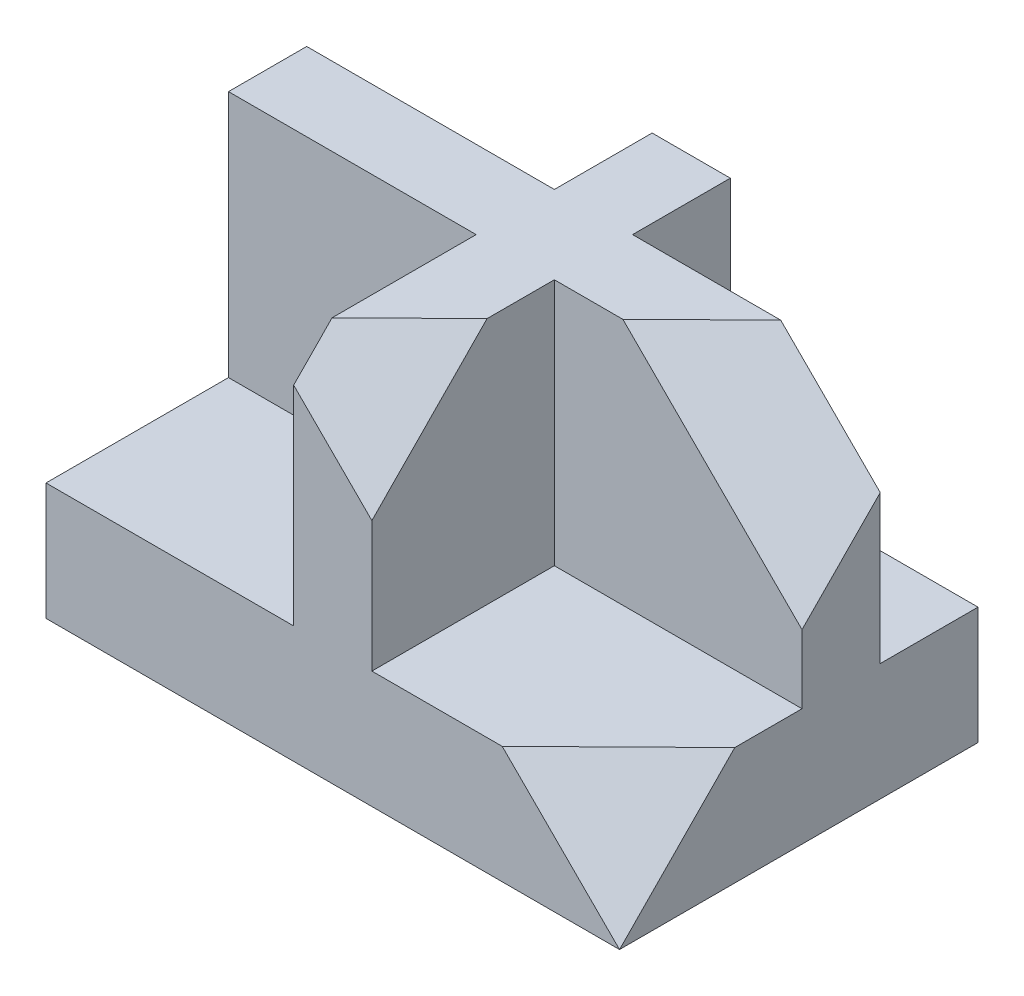
ISO-10303-21;
HEADER;
FILE_DESCRIPTION(('STEP AP214'),'2;1');
FILE_NAME('part.step','',(''),(''),'','','');
FILE_SCHEMA(('AUTOMOTIVE_DESIGN { 1 0 10303 214 1 1 1 1 }'));
ENDSEC;
DATA;
#1=APPLICATION_CONTEXT('core data for automotive mechanical design processes');
#2=APPLICATION_PROTOCOL_DEFINITION('international standard','automotive_design',2000,#1);
#3=PRODUCT_CONTEXT('',#1,'mechanical');
#4=PRODUCT('Part','Part','',(#3));
#5=PRODUCT_RELATED_PRODUCT_CATEGORY('part','',(#4));
#6=PRODUCT_DEFINITION_FORMATION('','',#4);
#7=PRODUCT_DEFINITION_CONTEXT('part definition',#1,'design');
#8=PRODUCT_DEFINITION('design','',#6,#7);
#9=PRODUCT_DEFINITION_SHAPE('','',#8);
#10=(LENGTH_UNIT() NAMED_UNIT(*) SI_UNIT(.MILLI.,.METRE.));
#11=(NAMED_UNIT(*) PLANE_ANGLE_UNIT() SI_UNIT($,.RADIAN.));
#12=(NAMED_UNIT(*) SI_UNIT($,.STERADIAN.) SOLID_ANGLE_UNIT());
#13=UNCERTAINTY_MEASURE_WITH_UNIT(LENGTH_MEASURE(1.E-05),#10,'distance_accuracy_value','');
#14=(GEOMETRIC_REPRESENTATION_CONTEXT(3) GLOBAL_UNCERTAINTY_ASSIGNED_CONTEXT((#13)) GLOBAL_UNIT_ASSIGNED_CONTEXT((#10,
#11,#12)) REPRESENTATION_CONTEXT('',''));
#15=CARTESIAN_POINT('',(0.,0.,0.));
#16=DIRECTION('',(0.,0.,1.));
#17=DIRECTION('',(1.,0.,0.));
#18=AXIS2_PLACEMENT_3D('',#15,#16,#17);
#19=CARTESIAN_POINT('',(0.,18.,0.));
#20=DIRECTION('',(0.,-1.,0.));
#21=DIRECTION('',(0.,0.,-1.));
#22=AXIS2_PLACEMENT_3D('',#19,#20,#21);
#23=PLANE('',#22);
#24=DIRECTION('',(-0.713448160609426,0.,0.70070801488425));
#25=VECTOR('',#24,1.);
#26=CARTESIAN_POINT('',(26.5135529946435,18.,26.9956175945464));
#27=LINE('',#26,#25);
#28=CARTESIAN_POINT('',(44.,18.,9.82142857142857));
#29=VERTEX_POINT('',#28);
#30=CARTESIAN_POINT('',(25.9999999999998,18.,27.5));
#31=VERTEX_POINT('',#30);
#32=EDGE_CURVE('E304',#29,#31,#27,.T.);
#33=ORIENTED_EDGE('',*,*,#32,.F.);
#34=DIRECTION('',(0.,0.,1.));
#35=VECTOR('',#34,1.);
#36=CARTESIAN_POINT('',(44.,18.,-27.5));
#37=LINE('',#36,#35);
#38=CARTESIAN_POINT('',(44.,18.,-0.500000000000011));
#39=VERTEX_POINT('',#38);
#40=EDGE_CURVE('E218',#39,#29,#37,.T.);
#41=ORIENTED_EDGE('',*,*,#40,.F.);
#42=DIRECTION('',(1.,0.,0.));
#43=VECTOR('',#42,1.);
#44=CARTESIAN_POINT('',(6.,18.,-0.500000000000004));
#45=LINE('',#44,#43);
#46=CARTESIAN_POINT('',(6.,18.,-0.500000000000004));
#47=VERTEX_POINT('',#46);
#48=EDGE_CURVE('E278',#47,#39,#45,.T.);
#49=ORIENTED_EDGE('',*,*,#48,.F.);
#50=DIRECTION('',(0.,0.,-1.));
#51=VECTOR('',#50,1.);
#52=CARTESIAN_POINT('',(6.,18.,27.5));
#53=LINE('',#52,#51);
#54=CARTESIAN_POINT('',(6.00000000000001,18.,27.5));
#55=VERTEX_POINT('',#54);
#56=EDGE_CURVE('E274',#55,#47,#53,.T.);
#57=ORIENTED_EDGE('',*,*,#56,.F.);
#58=DIRECTION('',(1.,0.,0.));
#59=VECTOR('',#58,1.);
#60=CARTESIAN_POINT('',(-44.,18.,27.5));
#61=LINE('',#60,#59);
#62=EDGE_CURVE('E221',#55,#31,#61,.T.);
#63=ORIENTED_EDGE('',*,*,#62,.T.);
#64=EDGE_LOOP('',(#33,#41,#49,#57,#63));
#65=FACE_BOUND('',#64,.T.);
#66=ADVANCED_FACE('F33',(#65),#23,.F.);
#67=CARTESIAN_POINT('',(-44.,18.,27.5));
#68=DIRECTION('',(0.,0.,-1.));
#69=DIRECTION('',(-1.,0.,0.));
#70=AXIS2_PLACEMENT_3D('',#67,#68,#69);
#71=PLANE('',#70);
#72=DIRECTION('',(-0.707106781186551,0.707106781186544,0.));
#73=VECTOR('',#72,1.);
#74=CARTESIAN_POINT('',(44.,0.,27.5));
#75=LINE('',#74,#73);
#76=CARTESIAN_POINT('',(6.00000000000001,37.9999999999996,27.5));
#77=VERTEX_POINT('',#76);
#78=CARTESIAN_POINT('',(-5.99999999999999,49.9999999999994,27.5));
#79=VERTEX_POINT('',#78);
#80=EDGE_CURVE('E165',#77,#79,#75,.T.);
#81=ORIENTED_EDGE('',*,*,#80,.T.);
#82=DIRECTION('',(0.,-1.,0.));
#83=VECTOR('',#82,1.);
#84=CARTESIAN_POINT('',(-6.,56.,27.5));
#85=LINE('',#84,#83);
#86=CARTESIAN_POINT('',(-6.00000000000001,18.,27.5));
#87=VERTEX_POINT('',#86);
#88=EDGE_CURVE('E197',#79,#87,#85,.T.);
#89=ORIENTED_EDGE('',*,*,#88,.T.);
#90=CARTESIAN_POINT('',(-44.,18.,27.5));
#91=VERTEX_POINT('',#90);
#92=EDGE_CURVE('E222',#91,#87,#61,.T.);
#93=ORIENTED_EDGE('',*,*,#92,.F.);
#94=DIRECTION('',(0.,-1.,0.));
#95=VECTOR('',#94,1.);
#96=CARTESIAN_POINT('',(-44.,18.,27.5));
#97=LINE('',#96,#95);
#98=CARTESIAN_POINT('',(-44.,0.,27.5));
#99=VERTEX_POINT('',#98);
#100=EDGE_CURVE('E241',#91,#99,#97,.T.);
#101=ORIENTED_EDGE('',*,*,#100,.T.);
#102=DIRECTION('',(1.,0.,0.));
#103=VECTOR('',#102,1.);
#104=CARTESIAN_POINT('',(-44.,0.,27.5));
#105=LINE('',#104,#103);
#106=CARTESIAN_POINT('',(44.,0.,27.5));
#107=VERTEX_POINT('',#106);
#108=EDGE_CURVE('E234',#99,#107,#105,.T.);
#109=ORIENTED_EDGE('',*,*,#108,.T.);
#110=EDGE_CURVE('E176',#107,#31,#75,.T.);
#111=ORIENTED_EDGE('',*,*,#110,.T.);
#112=ORIENTED_EDGE('',*,*,#62,.F.);
#113=DIRECTION('',(0.,-1.,0.));
#114=VECTOR('',#113,1.);
#115=CARTESIAN_POINT('',(6.,56.,27.5));
#116=LINE('',#115,#114);
#117=EDGE_CURVE('E195',#77,#55,#116,.T.);
#118=ORIENTED_EDGE('',*,*,#117,.F.);
#119=EDGE_LOOP('',(#81,#89,#93,#101,#109,#111,#112,#118));
#120=FACE_BOUND('',#119,.T.);
#121=ADVANCED_FACE('F261',(#120),#71,.F.);
#122=CARTESIAN_POINT('',(44.,18.,-27.5));
#123=DIRECTION('',(1.,0.,0.));
#124=DIRECTION('',(0.,0.,-1.));
#125=AXIS2_PLACEMENT_3D('',#122,#123,#124);
#126=PLANE('',#125);
#127=DIRECTION('',(0.,-1.,0.));
#128=VECTOR('',#127,1.);
#129=CARTESIAN_POINT('',(44.,56.,-12.5));
#130=LINE('',#129,#128);
#131=CARTESIAN_POINT('',(44.,40.7272727272727,-12.5));
#132=VERTEX_POINT('',#131);
#133=CARTESIAN_POINT('',(44.,18.,-12.5));
#134=VERTEX_POINT('',#133);
#135=EDGE_CURVE('E172',#132,#134,#130,.T.);
#136=ORIENTED_EDGE('',*,*,#135,.F.);
#137=DIRECTION('',(0.,-0.713448160609423,0.700708014884254));
#138=VECTOR('',#137,1.);
#139=CARTESIAN_POINT('',(44.,56.,-27.5));
#140=LINE('',#139,#138);
#141=CARTESIAN_POINT('',(44.,28.5090909090909,-0.499999999999997));
#142=VERTEX_POINT('',#141);
#143=EDGE_CURVE('E158',#132,#142,#140,.T.);
#144=ORIENTED_EDGE('',*,*,#143,.T.);
#145=DIRECTION('',(0.,-1.,0.));
#146=VECTOR('',#145,1.);
#147=CARTESIAN_POINT('',(44.,56.,-0.500000000000003));
#148=LINE('',#147,#146);
#149=EDGE_CURVE('E183',#142,#39,#148,.T.);
#150=ORIENTED_EDGE('',*,*,#149,.T.);
#151=ORIENTED_EDGE('',*,*,#40,.T.);
#152=EDGE_CURVE('E166',#29,#107,#140,.T.);
#153=ORIENTED_EDGE('',*,*,#152,.T.);
#154=DIRECTION('',(0.,0.,1.));
#155=VECTOR('',#154,1.);
#156=CARTESIAN_POINT('',(44.,0.,-27.5));
#157=LINE('',#156,#155);
#158=CARTESIAN_POINT('',(44.,0.,-27.5));
#159=VERTEX_POINT('',#158);
#160=EDGE_CURVE('E231',#159,#107,#157,.T.);
#161=ORIENTED_EDGE('',*,*,#160,.F.);
#162=DIRECTION('',(0.,-1.,0.));
#163=VECTOR('',#162,1.);
#164=CARTESIAN_POINT('',(44.,18.,-27.5));
#165=LINE('',#164,#163);
#166=CARTESIAN_POINT('',(44.,18.,-27.5));
#167=VERTEX_POINT('',#166);
#168=EDGE_CURVE('E228',#167,#159,#165,.T.);
#169=ORIENTED_EDGE('',*,*,#168,.F.);
#170=EDGE_CURVE('E182',#167,#134,#37,.T.);
#171=ORIENTED_EDGE('',*,*,#170,.T.);
#172=EDGE_LOOP('',(#136,#144,#150,#151,#153,#161,#169,#171));
#173=FACE_BOUND('',#172,.T.);
#174=ADVANCED_FACE('F179',(#173),#126,.T.);
#175=CARTESIAN_POINT('',(-6.00000000000001,56.,-0.499999999999992));
#176=DIRECTION('',(1.,0.,0.));
#177=DIRECTION('',(0.,0.,-1.));
#178=AXIS2_PLACEMENT_3D('',#175,#176,#177);
#179=PLANE('',#178);
#180=DIRECTION('',(0.,-0.713448160609423,0.700708014884254));
#181=VECTOR('',#180,1.);
#182=CARTESIAN_POINT('',(-6.,67.0517773088781,10.7527187144941));
#183=LINE('',#182,#181);
#184=CARTESIAN_POINT('',(-5.99999999999999,56.,21.6071428571423));
#185=VERTEX_POINT('',#184);
#186=EDGE_CURVE('E337',#185,#79,#183,.T.);
#187=ORIENTED_EDGE('',*,*,#186,.F.);
#188=DIRECTION('',(0.,0.,1.));
#189=VECTOR('',#188,1.);
#190=CARTESIAN_POINT('',(-6.00000000000001,56.,-0.499999999999992));
#191=LINE('',#190,#189);
#192=CARTESIAN_POINT('',(-6.00000000000001,56.,-0.499999999999992));
#193=VERTEX_POINT('',#192);
#194=EDGE_CURVE('E320',#193,#185,#191,.T.);
#195=ORIENTED_EDGE('',*,*,#194,.F.);
#196=DIRECTION('',(0.,-1.,0.));
#197=VECTOR('',#196,1.);
#198=CARTESIAN_POINT('',(-6.00000000000001,56.,-0.499999999999992));
#199=LINE('',#198,#197);
#200=CARTESIAN_POINT('',(-6.00000000000001,18.,-0.499999999999992));
#201=VERTEX_POINT('',#200);
#202=EDGE_CURVE('E199',#193,#201,#199,.T.);
#203=ORIENTED_EDGE('',*,*,#202,.T.);
#204=DIRECTION('',(0.,0.,1.));
#205=VECTOR('',#204,1.);
#206=CARTESIAN_POINT('',(-6.00000000000001,18.,-0.499999999999992));
#207=LINE('',#206,#205);
#208=EDGE_CURVE('E267',#201,#87,#207,.T.);
#209=ORIENTED_EDGE('',*,*,#208,.T.);
#210=ORIENTED_EDGE('',*,*,#88,.F.);
#211=EDGE_LOOP('',(#187,#195,#203,#209,#210));
#212=FACE_BOUND('',#211,.T.);
#213=ADVANCED_FACE('F271',(#212),#179,.F.);
#214=CARTESIAN_POINT('',(6.,56.,27.5));
#215=DIRECTION('',(-1.,0.,0.));
#216=DIRECTION('',(0.,0.,1.));
#217=AXIS2_PLACEMENT_3D('',#214,#215,#216);
#218=PLANE('',#217);
#219=DIRECTION('',(0.,0.713448160609423,-0.700708014884254));
#220=VECTOR('',#219,1.);
#221=CARTESIAN_POINT('',(6.,47.1621490017852,18.5014608018177));
#222=LINE('',#221,#220);
#223=CARTESIAN_POINT('',(6.00000000000001,56.,9.82142857142814));
#224=VERTEX_POINT('',#223);
#225=EDGE_CURVE('E56',#77,#224,#222,.T.);
#226=ORIENTED_EDGE('',*,*,#225,.F.);
#227=ORIENTED_EDGE('',*,*,#117,.T.);
#228=ORIENTED_EDGE('',*,*,#56,.T.);
#229=DIRECTION('',(0.,-1.,0.));
#230=VECTOR('',#229,1.);
#231=CARTESIAN_POINT('',(6.,56.,-0.500000000000004));
#232=LINE('',#231,#230);
#233=CARTESIAN_POINT('',(6.,56.,-0.500000000000004));
#234=VERTEX_POINT('',#233);
#235=EDGE_CURVE('E186',#234,#47,#232,.T.);
#236=ORIENTED_EDGE('',*,*,#235,.F.);
#237=DIRECTION('',(0.,0.,-1.));
#238=VECTOR('',#237,1.);
#239=CARTESIAN_POINT('',(6.,56.,27.5));
#240=LINE('',#239,#238);
#241=EDGE_CURVE('E328',#224,#234,#240,.T.);
#242=ORIENTED_EDGE('',*,*,#241,.F.);
#243=EDGE_LOOP('',(#226,#227,#228,#236,#242));
#244=FACE_BOUND('',#243,.T.);
#245=ADVANCED_FACE('F374',(#244),#218,.F.);
#246=CARTESIAN_POINT('',(6.,56.,-0.500000000000004));
#247=DIRECTION('',(0.,0.,-1.));
#248=DIRECTION('',(-1.,0.,0.));
#249=AXIS2_PLACEMENT_3D('',#246,#247,#248);
#250=PLANE('',#249);
#251=DIRECTION('',(0.707106781186551,-0.707106781186544,0.));
#252=VECTOR('',#251,1.);
#253=CARTESIAN_POINT('',(11.2545454545452,61.2545454545453,-0.500000000000004));
#254=LINE('',#253,#252);
#255=CARTESIAN_POINT('',(16.5090909090906,56.,-0.5));
#256=VERTEX_POINT('',#255);
#257=EDGE_CURVE('E161',#256,#142,#254,.T.);
#258=ORIENTED_EDGE('',*,*,#257,.F.);
#259=DIRECTION('',(1.,0.,0.));
#260=VECTOR('',#259,1.);
#261=CARTESIAN_POINT('',(6.,56.,-0.500000000000004));
#262=LINE('',#261,#260);
#263=EDGE_CURVE('E298',#234,#256,#262,.T.);
#264=ORIENTED_EDGE('',*,*,#263,.F.);
#265=ORIENTED_EDGE('',*,*,#235,.T.);
#266=ORIENTED_EDGE('',*,*,#48,.T.);
#267=ORIENTED_EDGE('',*,*,#149,.F.);
#268=EDGE_LOOP('',(#258,#264,#265,#266,#267));
#269=FACE_BOUND('',#268,.T.);
#270=ADVANCED_FACE('F335',(#269),#250,.F.);
#271=CARTESIAN_POINT('',(44.,56.,-12.5));
#272=DIRECTION('',(0.,0.,1.));
#273=DIRECTION('',(1.,0.,0.));
#274=AXIS2_PLACEMENT_3D('',#271,#272,#273);
#275=PLANE('',#274);
#276=DIRECTION('',(-0.707106781186551,0.707106781186544,0.));
#277=VECTOR('',#276,1.);
#278=CARTESIAN_POINT('',(36.3636363636364,48.3636363636363,-12.5));
#279=LINE('',#278,#277);
#280=CARTESIAN_POINT('',(28.7272727272726,56.,-12.5));
#281=VERTEX_POINT('',#280);
#282=EDGE_CURVE('E48',#132,#281,#279,.T.);
#283=ORIENTED_EDGE('',*,*,#282,.F.);
#284=ORIENTED_EDGE('',*,*,#135,.T.);
#285=DIRECTION('',(-1.,0.,0.));
#286=VECTOR('',#285,1.);
#287=CARTESIAN_POINT('',(44.,18.,-12.5));
#288=LINE('',#287,#286);
#289=CARTESIAN_POINT('',(6.,18.,-12.5));
#290=VERTEX_POINT('',#289);
#291=EDGE_CURVE('E286',#134,#290,#288,.T.);
#292=ORIENTED_EDGE('',*,*,#291,.T.);
#293=DIRECTION('',(0.,-1.,0.));
#294=VECTOR('',#293,1.);
#295=CARTESIAN_POINT('',(6.,56.,-12.5));
#296=LINE('',#295,#294);
#297=CARTESIAN_POINT('',(6.,56.,-12.5));
#298=VERTEX_POINT('',#297);
#299=EDGE_CURVE('E184',#298,#290,#296,.T.);
#300=ORIENTED_EDGE('',*,*,#299,.F.);
#301=DIRECTION('',(-1.,0.,0.));
#302=VECTOR('',#301,1.);
#303=CARTESIAN_POINT('',(44.,56.,-12.5));
#304=LINE('',#303,#302);
#305=EDGE_CURVE('E175',#281,#298,#304,.T.);
#306=ORIENTED_EDGE('',*,*,#305,.F.);
#307=EDGE_LOOP('',(#283,#284,#292,#300,#306));
#308=FACE_BOUND('',#307,.T.);
#309=ADVANCED_FACE('F170',(#308),#275,.F.);
#310=CARTESIAN_POINT('',(0.,56.,0.));
#311=DIRECTION('',(0.,1.,0.));
#312=DIRECTION('',(0.,0.,1.));
#313=AXIS2_PLACEMENT_3D('',#310,#311,#312);
#314=PLANE('',#313);
#315=ORIENTED_EDGE('',*,*,#194,.T.);
#316=DIRECTION('',(0.713448160609426,0.,-0.70070801488425));
#317=VECTOR('',#316,1.);
#318=CARTESIAN_POINT('',(7.85586755396826,56.,7.99870150949505));
#319=LINE('',#318,#317);
#320=EDGE_CURVE('E11',#185,#224,#319,.T.);
#321=ORIENTED_EDGE('',*,*,#320,.T.);
#322=ORIENTED_EDGE('',*,*,#241,.T.);
#323=ORIENTED_EDGE('',*,*,#263,.T.);
#324=EDGE_CURVE('E37',#256,#281,#319,.T.);
#325=ORIENTED_EDGE('',*,*,#324,.T.);
#326=ORIENTED_EDGE('',*,*,#305,.T.);
#327=DIRECTION('',(0.,0.,-1.));
#328=VECTOR('',#327,1.);
#329=CARTESIAN_POINT('',(6.,56.,-12.5));
#330=LINE('',#329,#328);
#331=CARTESIAN_POINT('',(6.,56.,-27.5));
#332=VERTEX_POINT('',#331);
#333=EDGE_CURVE('E291',#298,#332,#330,.T.);
#334=ORIENTED_EDGE('',*,*,#333,.T.);
#335=DIRECTION('',(-1.,0.,0.));
#336=VECTOR('',#335,1.);
#337=CARTESIAN_POINT('',(6.,56.,-27.5));
#338=LINE('',#337,#336);
#339=CARTESIAN_POINT('',(-6.,56.,-27.5));
#340=VERTEX_POINT('',#339);
#341=EDGE_CURVE('E290',#332,#340,#338,.T.);
#342=ORIENTED_EDGE('',*,*,#341,.T.);
#343=DIRECTION('',(0.,0.,1.));
#344=VECTOR('',#343,1.);
#345=CARTESIAN_POINT('',(-6.,56.,-27.5));
#346=LINE('',#345,#344);
#347=CARTESIAN_POINT('',(-6.,56.,-12.5));
#348=VERTEX_POINT('',#347);
#349=EDGE_CURVE('E322',#340,#348,#346,.T.);
#350=ORIENTED_EDGE('',*,*,#349,.T.);
#351=DIRECTION('',(-1.,0.,0.));
#352=VECTOR('',#351,1.);
#353=CARTESIAN_POINT('',(-6.,56.,-12.5));
#354=LINE('',#353,#352);
#355=CARTESIAN_POINT('',(-44.,56.,-12.5));
#356=VERTEX_POINT('',#355);
#357=EDGE_CURVE('E318',#348,#356,#354,.T.);
#358=ORIENTED_EDGE('',*,*,#357,.T.);
#359=DIRECTION('',(0.,0.,1.));
#360=VECTOR('',#359,1.);
#361=CARTESIAN_POINT('',(-44.,56.,-12.5));
#362=LINE('',#361,#360);
#363=CARTESIAN_POINT('',(-44.,56.,-0.499999999999992));
#364=VERTEX_POINT('',#363);
#365=EDGE_CURVE('E315',#356,#364,#362,.T.);
#366=ORIENTED_EDGE('',*,*,#365,.T.);
#367=DIRECTION('',(1.,0.,0.));
#368=VECTOR('',#367,1.);
#369=CARTESIAN_POINT('',(-44.,56.,-0.499999999999992));
#370=LINE('',#369,#368);
#371=EDGE_CURVE('E317',#364,#193,#370,.T.);
#372=ORIENTED_EDGE('',*,*,#371,.T.);
#373=EDGE_LOOP('',(#315,#321,#322,#323,#325,#326,#334,#342,#350,#358,#366,#372));
#374=FACE_BOUND('',#373,.T.);
#375=ADVANCED_FACE('F331',(#374),#314,.T.);
#376=DIRECTION('',(0.,0.,-1.));
#377=VECTOR('',#376,1.);
#378=CARTESIAN_POINT('',(6.,18.,-12.5));
#379=LINE('',#378,#377);
#380=CARTESIAN_POINT('',(6.00000000000001,18.,-27.5));
#381=VERTEX_POINT('',#380);
#382=EDGE_CURVE('E288',#290,#381,#379,.T.);
#383=ORIENTED_EDGE('',*,*,#382,.F.);
#384=ORIENTED_EDGE('',*,*,#291,.F.);
#385=ORIENTED_EDGE('',*,*,#170,.F.);
#386=DIRECTION('',(1.,0.,0.));
#387=VECTOR('',#386,1.);
#388=CARTESIAN_POINT('',(-44.,18.,-27.5));
#389=LINE('',#388,#387);
#390=EDGE_CURVE('E219',#381,#167,#389,.T.);
#391=ORIENTED_EDGE('',*,*,#390,.F.);
#392=EDGE_LOOP('',(#383,#384,#385,#391));
#393=FACE_BOUND('',#392,.T.);
#394=ADVANCED_FACE('F349',(#393),#23,.F.);
#395=ORIENTED_EDGE('',*,*,#208,.F.);
#396=DIRECTION('',(1.,0.,0.));
#397=VECTOR('',#396,1.);
#398=CARTESIAN_POINT('',(-44.,18.,-0.499999999999992));
#399=LINE('',#398,#397);
#400=CARTESIAN_POINT('',(-44.,18.,-0.499999999999994));
#401=VERTEX_POINT('',#400);
#402=EDGE_CURVE('E275',#401,#201,#399,.T.);
#403=ORIENTED_EDGE('',*,*,#402,.F.);
#404=DIRECTION('',(0.,0.,1.));
#405=VECTOR('',#404,1.);
#406=CARTESIAN_POINT('',(-44.,18.,-27.5));
#407=LINE('',#406,#405);
#408=EDGE_CURVE('E225',#401,#91,#407,.T.);
#409=ORIENTED_EDGE('',*,*,#408,.T.);
#410=ORIENTED_EDGE('',*,*,#92,.T.);
#411=EDGE_LOOP('',(#395,#403,#409,#410));
#412=FACE_BOUND('',#411,.T.);
#413=ADVANCED_FACE('F266',(#412),#23,.F.);
#414=DIRECTION('',(-1.,0.,0.));
#415=VECTOR('',#414,1.);
#416=CARTESIAN_POINT('',(-6.,18.,-12.5));
#417=LINE('',#416,#415);
#418=CARTESIAN_POINT('',(-6.,18.,-12.5));
#419=VERTEX_POINT('',#418);
#420=CARTESIAN_POINT('',(-44.,18.,-12.5));
#421=VERTEX_POINT('',#420);
#422=EDGE_CURVE('E280',#419,#421,#417,.T.);
#423=ORIENTED_EDGE('',*,*,#422,.F.);
#424=DIRECTION('',(0.,0.,1.));
#425=VECTOR('',#424,1.);
#426=CARTESIAN_POINT('',(-6.,18.,-27.5));
#427=LINE('',#426,#425);
#428=CARTESIAN_POINT('',(-6.,18.,-27.5));
#429=VERTEX_POINT('',#428);
#430=EDGE_CURVE('E302',#429,#419,#427,.T.);
#431=ORIENTED_EDGE('',*,*,#430,.F.);
#432=CARTESIAN_POINT('',(-44.,18.,-27.5));
#433=VERTEX_POINT('',#432);
#434=EDGE_CURVE('E215',#433,#429,#389,.T.);
#435=ORIENTED_EDGE('',*,*,#434,.F.);
#436=EDGE_CURVE('E226',#433,#421,#407,.T.);
#437=ORIENTED_EDGE('',*,*,#436,.T.);
#438=EDGE_LOOP('',(#423,#431,#435,#437));
#439=FACE_BOUND('',#438,.T.);
#440=ADVANCED_FACE('F346',(#439),#23,.F.);
#441=CARTESIAN_POINT('',(-44.,18.,-27.5));
#442=DIRECTION('',(0.,0.,-1.));
#443=DIRECTION('',(-1.,0.,0.));
#444=AXIS2_PLACEMENT_3D('',#441,#442,#443);
#445=PLANE('',#444);
#446=DIRECTION('',(1.,0.,0.));
#447=VECTOR('',#446,1.);
#448=CARTESIAN_POINT('',(-44.,0.,-27.5));
#449=LINE('',#448,#447);
#450=CARTESIAN_POINT('',(-44.,0.,-27.5));
#451=VERTEX_POINT('',#450);
#452=EDGE_CURVE('E214',#451,#159,#449,.T.);
#453=ORIENTED_EDGE('',*,*,#452,.F.);
#454=DIRECTION('',(0.,-1.,0.));
#455=VECTOR('',#454,1.);
#456=CARTESIAN_POINT('',(-44.,18.,-27.5));
#457=LINE('',#456,#455);
#458=EDGE_CURVE('E239',#433,#451,#457,.T.);
#459=ORIENTED_EDGE('',*,*,#458,.F.);
#460=ORIENTED_EDGE('',*,*,#434,.T.);
#461=DIRECTION('',(0.,-1.,0.));
#462=VECTOR('',#461,1.);
#463=CARTESIAN_POINT('',(-6.,56.,-27.5));
#464=LINE('',#463,#462);
#465=EDGE_CURVE('E211',#340,#429,#464,.T.);
#466=ORIENTED_EDGE('',*,*,#465,.F.);
#467=ORIENTED_EDGE('',*,*,#341,.F.);
#468=DIRECTION('',(0.,-1.,0.));
#469=VECTOR('',#468,1.);
#470=CARTESIAN_POINT('',(6.,56.,-27.5));
#471=LINE('',#470,#469);
#472=EDGE_CURVE('E189',#332,#381,#471,.T.);
#473=ORIENTED_EDGE('',*,*,#472,.T.);
#474=ORIENTED_EDGE('',*,*,#390,.T.);
#475=ORIENTED_EDGE('',*,*,#168,.T.);
#476=EDGE_LOOP('',(#453,#459,#460,#466,#467,#473,#474,#475));
#477=FACE_BOUND('',#476,.T.);
#478=ADVANCED_FACE('F35',(#477),#445,.T.);
#479=CARTESIAN_POINT('',(-44.,18.,-27.5));
#480=DIRECTION('',(1.,0.,0.));
#481=DIRECTION('',(0.,0.,-1.));
#482=AXIS2_PLACEMENT_3D('',#479,#480,#481);
#483=PLANE('',#482);
#484=DIRECTION('',(0.,0.,1.));
#485=VECTOR('',#484,1.);
#486=CARTESIAN_POINT('',(-44.,0.,-27.5));
#487=LINE('',#486,#485);
#488=EDGE_CURVE('E237',#451,#99,#487,.T.);
#489=ORIENTED_EDGE('',*,*,#488,.T.);
#490=ORIENTED_EDGE('',*,*,#100,.F.);
#491=ORIENTED_EDGE('',*,*,#408,.F.);
#492=DIRECTION('',(0.,-1.,0.));
#493=VECTOR('',#492,1.);
#494=CARTESIAN_POINT('',(-44.,56.,-0.499999999999992));
#495=LINE('',#494,#493);
#496=EDGE_CURVE('E202',#364,#401,#495,.T.);
#497=ORIENTED_EDGE('',*,*,#496,.F.);
#498=ORIENTED_EDGE('',*,*,#365,.F.);
#499=DIRECTION('',(0.,-1.,0.));
#500=VECTOR('',#499,1.);
#501=CARTESIAN_POINT('',(-44.,56.,-12.5));
#502=LINE('',#501,#500);
#503=EDGE_CURVE('E205',#356,#421,#502,.T.);
#504=ORIENTED_EDGE('',*,*,#503,.T.);
#505=ORIENTED_EDGE('',*,*,#436,.F.);
#506=ORIENTED_EDGE('',*,*,#458,.T.);
#507=EDGE_LOOP('',(#489,#490,#491,#497,#498,#504,#505,#506));
#508=FACE_BOUND('',#507,.T.);
#509=ADVANCED_FACE('F255',(#508),#483,.F.);
#510=CARTESIAN_POINT('',(0.,0.,0.));
#511=DIRECTION('',(0.,-1.,0.));
#512=DIRECTION('',(0.,0.,-1.));
#513=AXIS2_PLACEMENT_3D('',#510,#511,#512);
#514=PLANE('',#513);
#515=ORIENTED_EDGE('',*,*,#452,.T.);
#516=ORIENTED_EDGE('',*,*,#160,.T.);
#517=ORIENTED_EDGE('',*,*,#108,.F.);
#518=ORIENTED_EDGE('',*,*,#488,.F.);
#519=EDGE_LOOP('',(#515,#516,#517,#518));
#520=FACE_BOUND('',#519,.T.);
#521=ADVANCED_FACE('F252',(#520),#514,.T.);
#522=CARTESIAN_POINT('',(-6.,56.,-27.5));
#523=DIRECTION('',(1.,0.,0.));
#524=DIRECTION('',(0.,0.,-1.));
#525=AXIS2_PLACEMENT_3D('',#522,#523,#524);
#526=PLANE('',#525);
#527=ORIENTED_EDGE('',*,*,#430,.T.);
#528=DIRECTION('',(0.,-1.,0.));
#529=VECTOR('',#528,1.);
#530=CARTESIAN_POINT('',(-6.,56.,-12.5));
#531=LINE('',#530,#529);
#532=EDGE_CURVE('E208',#348,#419,#531,.T.);
#533=ORIENTED_EDGE('',*,*,#532,.F.);
#534=ORIENTED_EDGE('',*,*,#349,.F.);
#535=ORIENTED_EDGE('',*,*,#465,.T.);
#536=EDGE_LOOP('',(#527,#533,#534,#535));
#537=FACE_BOUND('',#536,.T.);
#538=ADVANCED_FACE('F345',(#537),#526,.F.);
#539=CARTESIAN_POINT('',(-6.,56.,-12.5));
#540=DIRECTION('',(0.,0.,1.));
#541=DIRECTION('',(1.,0.,0.));
#542=AXIS2_PLACEMENT_3D('',#539,#540,#541);
#543=PLANE('',#542);
#544=ORIENTED_EDGE('',*,*,#422,.T.);
#545=ORIENTED_EDGE('',*,*,#503,.F.);
#546=ORIENTED_EDGE('',*,*,#357,.F.);
#547=ORIENTED_EDGE('',*,*,#532,.T.);
#548=EDGE_LOOP('',(#544,#545,#546,#547));
#549=FACE_BOUND('',#548,.T.);
#550=ADVANCED_FACE('F308',(#549),#543,.F.);
#551=CARTESIAN_POINT('',(-44.,56.,-0.499999999999992));
#552=DIRECTION('',(0.,0.,-1.));
#553=DIRECTION('',(-1.,0.,0.));
#554=AXIS2_PLACEMENT_3D('',#551,#552,#553);
#555=PLANE('',#554);
#556=ORIENTED_EDGE('',*,*,#402,.T.);
#557=ORIENTED_EDGE('',*,*,#202,.F.);
#558=ORIENTED_EDGE('',*,*,#371,.F.);
#559=ORIENTED_EDGE('',*,*,#496,.T.);
#560=EDGE_LOOP('',(#556,#557,#558,#559));
#561=FACE_BOUND('',#560,.T.);
#562=ADVANCED_FACE('F385',(#561),#555,.F.);
#563=CARTESIAN_POINT('',(6.,56.,-12.5));
#564=DIRECTION('',(-1.,0.,0.));
#565=DIRECTION('',(0.,0.,1.));
#566=AXIS2_PLACEMENT_3D('',#563,#564,#565);
#567=PLANE('',#566);
#568=ORIENTED_EDGE('',*,*,#382,.T.);
#569=ORIENTED_EDGE('',*,*,#472,.F.);
#570=ORIENTED_EDGE('',*,*,#333,.F.);
#571=ORIENTED_EDGE('',*,*,#299,.T.);
#572=EDGE_LOOP('',(#568,#569,#570,#571));
#573=FACE_BOUND('',#572,.T.);
#574=ADVANCED_FACE('F388',(#573),#567,.F.);
#575=CARTESIAN_POINT('',(23.7099934683211,23.7099934683214,24.1410842586545));
#576=DIRECTION('',(0.573851430979998,0.573851430980004,0.584285093361459));
#577=DIRECTION('',(0.,-0.713448160609423,0.700708014884254));
#578=AXIS2_PLACEMENT_3D('',#575,#576,#577);
#579=PLANE('',#578);
#580=ORIENTED_EDGE('',*,*,#257,.T.);
#581=ORIENTED_EDGE('',*,*,#143,.F.);
#582=ORIENTED_EDGE('',*,*,#282,.T.);
#583=ORIENTED_EDGE('',*,*,#324,.F.);
#584=EDGE_LOOP('',(#580,#581,#582,#583));
#585=FACE_BOUND('',#584,.T.);
#586=ADVANCED_FACE('F159',(#585),#579,.T.);
#587=ORIENTED_EDGE('',*,*,#186,.T.);
#588=ORIENTED_EDGE('',*,*,#80,.F.);
#589=ORIENTED_EDGE('',*,*,#225,.T.);
#590=ORIENTED_EDGE('',*,*,#320,.F.);
#591=EDGE_LOOP('',(#587,#588,#589,#590));
#592=FACE_BOUND('',#591,.T.);
#593=ADVANCED_FACE('F372',(#592),#579,.T.);
#594=ORIENTED_EDGE('',*,*,#32,.T.);
#595=ORIENTED_EDGE('',*,*,#110,.F.);
#596=ORIENTED_EDGE('',*,*,#152,.F.);
#597=EDGE_LOOP('',(#594,#595,#596));
#598=FACE_BOUND('',#597,.T.);
#599=ADVANCED_FACE('F370',(#598),#579,.T.);
#600=CLOSED_SHELL('',(#66,#121,#174,#213,#245,#270,#309,#375,#394,#413,#440,#478,#509,#521,#538,
#550,#562,#574,#586,#593,#599));
#601=MANIFOLD_SOLID_BREP('B2',#600);
#602=ADVANCED_BREP_SHAPE_REPRESENTATION('',(#18,#601),#14);
#603=SHAPE_DEFINITION_REPRESENTATION(#9,#602);
ENDSEC;
END-ISO-10303-21;
